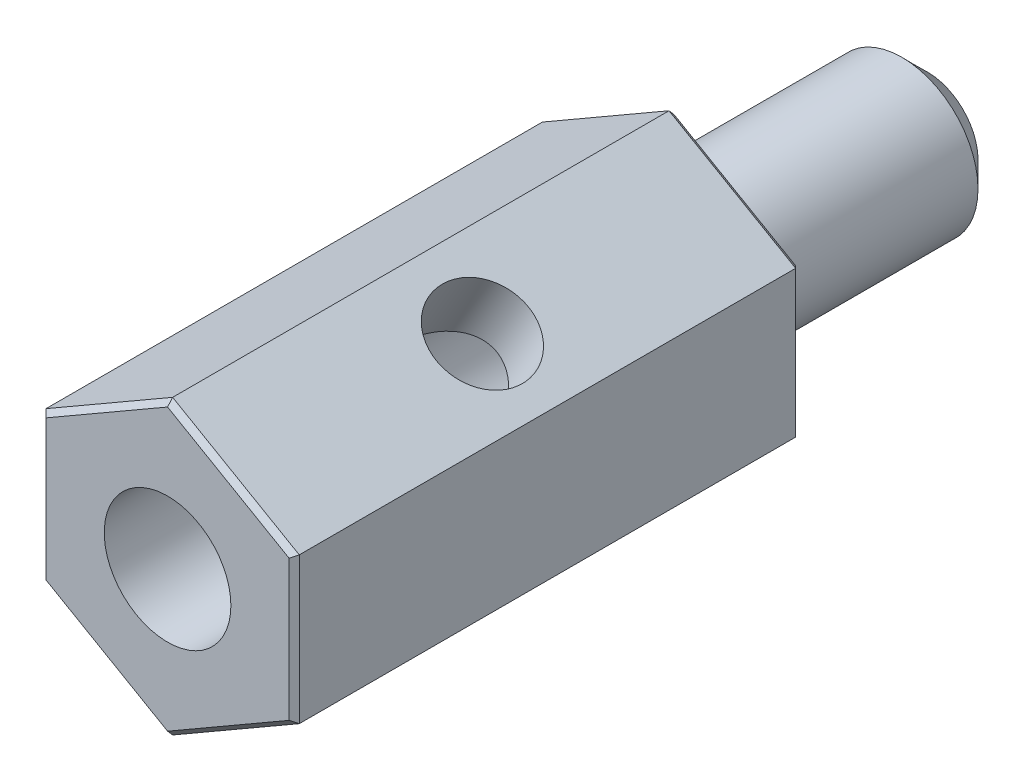
ISO-10303-21;
HEADER;
FILE_DESCRIPTION(('STEP AP214'),'2;1');
FILE_NAME('part.step','',(''),(''),'','','');
FILE_SCHEMA(('AUTOMOTIVE_DESIGN { 1 0 10303 214 1 1 1 1 }'));
ENDSEC;
DATA;
#1=APPLICATION_CONTEXT('core data for automotive mechanical design processes');
#2=APPLICATION_PROTOCOL_DEFINITION('international standard','automotive_design',2000,#1);
#3=PRODUCT_CONTEXT('',#1,'mechanical');
#4=PRODUCT('Part','Part','',(#3));
#5=PRODUCT_RELATED_PRODUCT_CATEGORY('part','',(#4));
#6=PRODUCT_DEFINITION_FORMATION('','',#4);
#7=PRODUCT_DEFINITION_CONTEXT('part definition',#1,'design');
#8=PRODUCT_DEFINITION('design','',#6,#7);
#9=PRODUCT_DEFINITION_SHAPE('','',#8);
#10=(LENGTH_UNIT() NAMED_UNIT(*) SI_UNIT(.MILLI.,.METRE.));
#11=(NAMED_UNIT(*) PLANE_ANGLE_UNIT() SI_UNIT($,.RADIAN.));
#12=(NAMED_UNIT(*) SI_UNIT($,.STERADIAN.) SOLID_ANGLE_UNIT());
#13=UNCERTAINTY_MEASURE_WITH_UNIT(LENGTH_MEASURE(1.E-05),#10,'distance_accuracy_value','');
#14=(GEOMETRIC_REPRESENTATION_CONTEXT(3) GLOBAL_UNCERTAINTY_ASSIGNED_CONTEXT((#13)) GLOBAL_UNIT_ASSIGNED_CONTEXT((#10,
#11,#12)) REPRESENTATION_CONTEXT('',''));
#15=CARTESIAN_POINT('',(0.,0.,0.));
#16=DIRECTION('',(0.,0.,1.));
#17=DIRECTION('',(1.,0.,0.));
#18=AXIS2_PLACEMENT_3D('',#15,#16,#17);
#19=CARTESIAN_POINT('',(0.,0.,0.));
#20=DIRECTION('',(0.,0.,1.));
#21=DIRECTION('',(1.,0.,0.));
#22=AXIS2_PLACEMENT_3D('',#19,#20,#21);
#23=PLANE('',#22);
#24=DIRECTION('',(0.,-1.,0.));
#25=VECTOR('',#24,1.);
#26=CARTESIAN_POINT('',(2.4,0.,0.));
#27=LINE('',#26,#25);
#28=CARTESIAN_POINT('',(2.39999999999999,1.38564064605513,0.));
#29=VERTEX_POINT('',#28);
#30=CARTESIAN_POINT('',(2.40000000000002,-1.38564064605508,0.));
#31=VERTEX_POINT('',#30);
#32=EDGE_CURVE('E50',#29,#31,#27,.T.);
#33=ORIENTED_EDGE('',*,*,#32,.T.);
#34=DIRECTION('',(-0.866025403784435,-0.500000000000007,0.));
#35=VECTOR('',#34,1.);
#36=CARTESIAN_POINT('',(1.20000000000002,-2.07846096908264,0.));
#37=LINE('',#36,#35);
#38=CARTESIAN_POINT('',(0.,-2.77128129211021,0.));
#39=VERTEX_POINT('',#38);
#40=EDGE_CURVE('E11',#31,#39,#37,.T.);
#41=ORIENTED_EDGE('',*,*,#40,.T.);
#42=DIRECTION('',(-0.866025403784441,0.499999999999995,0.));
#43=VECTOR('',#42,1.);
#44=CARTESIAN_POINT('',(-1.19999999999999,-2.07846096908266,0.));
#45=LINE('',#44,#43);
#46=CARTESIAN_POINT('',(-2.4,-1.38564064605511,0.));
#47=VERTEX_POINT('',#46);
#48=EDGE_CURVE('E216',#39,#47,#45,.T.);
#49=ORIENTED_EDGE('',*,*,#48,.T.);
#50=DIRECTION('',(0.,1.,0.));
#51=VECTOR('',#50,1.);
#52=CARTESIAN_POINT('',(-2.4,0.,0.));
#53=LINE('',#52,#51);
#54=CARTESIAN_POINT('',(-2.40000000000001,1.3856406460551,0.));
#55=VERTEX_POINT('',#54);
#56=EDGE_CURVE('E214',#47,#55,#53,.T.);
#57=ORIENTED_EDGE('',*,*,#56,.T.);
#58=DIRECTION('',(0.866025403784438,0.500000000000001,0.));
#59=VECTOR('',#58,1.);
#60=CARTESIAN_POINT('',(-1.2,2.07846096908265,0.));
#61=LINE('',#60,#59);
#62=CARTESIAN_POINT('',(0.,2.77128129211021,0.));
#63=VERTEX_POINT('',#62);
#64=EDGE_CURVE('E218',#55,#63,#61,.T.);
#65=ORIENTED_EDGE('',*,*,#64,.T.);
#66=DIRECTION('',(0.866025403784441,-0.499999999999995,0.));
#67=VECTOR('',#66,1.);
#68=CARTESIAN_POINT('',(1.19999999999999,2.07846096908267,0.));
#69=LINE('',#68,#67);
#70=EDGE_CURVE('E61',#63,#29,#69,.T.);
#71=ORIENTED_EDGE('',*,*,#70,.T.);
#72=EDGE_LOOP('',(#33,#41,#49,#57,#65,#71));
#73=FACE_BOUND('',#72,.T.);
#74=CARTESIAN_POINT('',(0.,0.,0.));
#75=DIRECTION('',(0.,0.,1.));
#76=DIRECTION('',(1.,0.,0.));
#77=AXIS2_PLACEMENT_3D('',#74,#75,#76);
#78=CIRCLE('',#77,1.5);
#79=CARTESIAN_POINT('',(1.5,0.,0.));
#80=VERTEX_POINT('',#79);
#81=EDGE_CURVE('E166',#80,#80,#78,.F.);
#82=ORIENTED_EDGE('',*,*,#81,.F.);
#83=EDGE_LOOP('',(#82));
#84=FACE_BOUND('',#83,.T.);
#85=ADVANCED_FACE('F37',(#73,#84),#23,.F.);
#86=CARTESIAN_POINT('',(2.49999999999999,1.44337567297409,10.));
#87=DIRECTION('',(-0.499999999999995,-0.866025403784442,0.));
#88=DIRECTION('',(0.866025403784442,-0.499999999999995,0.));
#89=AXIS2_PLACEMENT_3D('',#86,#87,#88);
#90=PLANE('',#89);
#91=CARTESIAN_POINT('',(1.24999999999999,2.16506350946111,5.03418419542379));
#92=DIRECTION('',(0.499999999999995,0.866025403784441,0.));
#93=DIRECTION('',(-0.866025403784442,0.499999999999995,0.));
#94=AXIS2_PLACEMENT_3D('',#91,#92,#93);
#95=CIRCLE('',#94,0.912306310352572);
#96=CARTESIAN_POINT('',(0.459919559201814,2.6212166646374,5.03418419542379));
#97=VERTEX_POINT('',#96);
#98=EDGE_CURVE('E257',#97,#97,#95,.T.);
#99=ORIENTED_EDGE('',*,*,#98,.F.);
#100=EDGE_LOOP('',(#99));
#101=FACE_BOUND('',#100,.T.);
#102=DIRECTION('',(0.,0.,-1.));
#103=VECTOR('',#102,1.);
#104=CARTESIAN_POINT('',(0.,2.88675134594813,10.));
#105=LINE('',#104,#103);
#106=CARTESIAN_POINT('',(0.,2.88675134594813,9.9));
#107=VERTEX_POINT('',#106);
#108=CARTESIAN_POINT('',(0.,2.88675134594813,0.100000000000001));
#109=VERTEX_POINT('',#108);
#110=EDGE_CURVE('E163',#107,#109,#105,.T.);
#111=ORIENTED_EDGE('',*,*,#110,.F.);
#112=DIRECTION('',(0.866025403784442,-0.499999999999995,0.));
#113=VECTOR('',#112,1.);
#114=CARTESIAN_POINT('',(2.49999999999999,1.44337567297409,9.9));
#115=LINE('',#114,#113);
#116=CARTESIAN_POINT('',(2.49999999999999,1.44337567297409,9.9));
#117=VERTEX_POINT('',#116);
#118=EDGE_CURVE('E212',#107,#117,#115,.T.);
#119=ORIENTED_EDGE('',*,*,#118,.T.);
#120=DIRECTION('',(0.,0.,-1.));
#121=VECTOR('',#120,1.);
#122=CARTESIAN_POINT('',(2.49999999999999,1.44337567297409,10.));
#123=LINE('',#122,#121);
#124=CARTESIAN_POINT('',(2.49999999999999,1.44337567297409,0.100000000000001));
#125=VERTEX_POINT('',#124);
#126=EDGE_CURVE('E141',#117,#125,#123,.T.);
#127=ORIENTED_EDGE('',*,*,#126,.T.);
#128=DIRECTION('',(-0.866025403784442,0.499999999999995,0.));
#129=VECTOR('',#128,1.);
#130=CARTESIAN_POINT('',(2.49999999999999,1.44337567297409,0.100000000000001));
#131=LINE('',#130,#129);
#132=EDGE_CURVE('E210',#125,#109,#131,.T.);
#133=ORIENTED_EDGE('',*,*,#132,.T.);
#134=EDGE_LOOP('',(#111,#119,#127,#133));
#135=FACE_BOUND('',#134,.T.);
#136=ADVANCED_FACE('F273',(#101,#135),#90,.F.);
#137=CARTESIAN_POINT('',(0.,2.88675134594813,10.));
#138=DIRECTION('',(0.500000000000001,-0.866025403784438,0.));
#139=DIRECTION('',(0.866025403784438,0.500000000000001,0.));
#140=AXIS2_PLACEMENT_3D('',#137,#138,#139);
#141=PLANE('',#140);
#142=DIRECTION('',(0.,0.,-1.));
#143=VECTOR('',#142,1.);
#144=CARTESIAN_POINT('',(-2.50000000000001,1.44337567297406,10.));
#145=LINE('',#144,#143);
#146=CARTESIAN_POINT('',(-2.50000000000001,1.44337567297406,9.9));
#147=VERTEX_POINT('',#146);
#148=CARTESIAN_POINT('',(-2.50000000000001,1.44337567297406,0.100000000000001));
#149=VERTEX_POINT('',#148);
#150=EDGE_CURVE('E160',#147,#149,#145,.T.);
#151=ORIENTED_EDGE('',*,*,#150,.F.);
#152=DIRECTION('',(0.866025403784438,0.500000000000001,0.));
#153=VECTOR('',#152,1.);
#154=CARTESIAN_POINT('',(0.,2.88675134594813,9.9));
#155=LINE('',#154,#153);
#156=EDGE_CURVE('E208',#147,#107,#155,.T.);
#157=ORIENTED_EDGE('',*,*,#156,.T.);
#158=ORIENTED_EDGE('',*,*,#110,.T.);
#159=DIRECTION('',(-0.866025403784438,-0.500000000000001,0.));
#160=VECTOR('',#159,1.);
#161=CARTESIAN_POINT('',(0.,2.88675134594813,0.100000000000001));
#162=LINE('',#161,#160);
#163=EDGE_CURVE('E206',#109,#149,#162,.T.);
#164=ORIENTED_EDGE('',*,*,#163,.T.);
#165=EDGE_LOOP('',(#151,#157,#158,#164));
#166=FACE_BOUND('',#165,.T.);
#167=ADVANCED_FACE('F279',(#166),#141,.F.);
#168=CARTESIAN_POINT('',(-2.50000000000001,1.44337567297406,10.));
#169=DIRECTION('',(1.,0.,0.));
#170=DIRECTION('',(0.,1.,0.));
#171=AXIS2_PLACEMENT_3D('',#168,#169,#170);
#172=PLANE('',#171);
#173=DIRECTION('',(0.,0.,-1.));
#174=VECTOR('',#173,1.);
#175=CARTESIAN_POINT('',(-2.5,-1.44337567297408,10.));
#176=LINE('',#175,#174);
#177=CARTESIAN_POINT('',(-2.5,-1.44337567297408,9.9));
#178=VERTEX_POINT('',#177);
#179=CARTESIAN_POINT('',(-2.5,-1.44337567297408,0.100000000000001));
#180=VERTEX_POINT('',#179);
#181=EDGE_CURVE('E157',#178,#180,#176,.T.);
#182=ORIENTED_EDGE('',*,*,#181,.F.);
#183=DIRECTION('',(0.,1.,0.));
#184=VECTOR('',#183,1.);
#185=CARTESIAN_POINT('',(-2.50000000000001,1.44337567297406,9.9));
#186=LINE('',#185,#184);
#187=EDGE_CURVE('E204',#178,#147,#186,.T.);
#188=ORIENTED_EDGE('',*,*,#187,.T.);
#189=ORIENTED_EDGE('',*,*,#150,.T.);
#190=DIRECTION('',(0.,-1.,0.));
#191=VECTOR('',#190,1.);
#192=CARTESIAN_POINT('',(-2.50000000000001,1.44337567297406,0.100000000000001));
#193=LINE('',#192,#191);
#194=EDGE_CURVE('E202',#149,#180,#193,.T.);
#195=ORIENTED_EDGE('',*,*,#194,.T.);
#196=EDGE_LOOP('',(#182,#188,#189,#195));
#197=FACE_BOUND('',#196,.T.);
#198=ADVANCED_FACE('F298',(#197),#172,.F.);
#199=CARTESIAN_POINT('',(-2.5,-1.44337567297408,10.));
#200=DIRECTION('',(0.499999999999995,0.866025403784442,0.));
#201=DIRECTION('',(-0.866025403784442,0.499999999999995,0.));
#202=AXIS2_PLACEMENT_3D('',#199,#200,#201);
#203=PLANE('',#202);
#204=CARTESIAN_POINT('',(-1.24999999999999,-2.1650635094611,5.03418419542379));
#205=DIRECTION('',(0.499999999999995,0.866025403784442,0.));
#206=DIRECTION('',(-0.866025403784442,0.499999999999995,0.));
#207=AXIS2_PLACEMENT_3D('',#204,#205,#206);
#208=CIRCLE('',#207,0.912306310352572);
#209=CARTESIAN_POINT('',(-2.04008044079817,-1.70891035428482,5.03418419542379));
#210=VERTEX_POINT('',#209);
#211=EDGE_CURVE('E241',#210,#210,#208,.T.);
#212=ORIENTED_EDGE('',*,*,#211,.T.);
#213=EDGE_LOOP('',(#212));
#214=FACE_BOUND('',#213,.T.);
#215=DIRECTION('',(0.,0.,-1.));
#216=VECTOR('',#215,1.);
#217=CARTESIAN_POINT('',(0.,-2.88675134594813,10.));
#218=LINE('',#217,#216);
#219=CARTESIAN_POINT('',(0.,-2.88675134594813,9.9));
#220=VERTEX_POINT('',#219);
#221=CARTESIAN_POINT('',(0.,-2.88675134594813,0.100000000000001));
#222=VERTEX_POINT('',#221);
#223=EDGE_CURVE('E154',#220,#222,#218,.T.);
#224=ORIENTED_EDGE('',*,*,#223,.F.);
#225=DIRECTION('',(-0.866025403784442,0.499999999999995,0.));
#226=VECTOR('',#225,1.);
#227=CARTESIAN_POINT('',(-2.5,-1.44337567297408,9.9));
#228=LINE('',#227,#226);
#229=EDGE_CURVE('E200',#220,#178,#228,.T.);
#230=ORIENTED_EDGE('',*,*,#229,.T.);
#231=ORIENTED_EDGE('',*,*,#181,.T.);
#232=DIRECTION('',(0.866025403784442,-0.499999999999995,0.));
#233=VECTOR('',#232,1.);
#234=CARTESIAN_POINT('',(-2.5,-1.44337567297408,0.100000000000001));
#235=LINE('',#234,#233);
#236=EDGE_CURVE('E198',#180,#222,#235,.T.);
#237=ORIENTED_EDGE('',*,*,#236,.T.);
#238=EDGE_LOOP('',(#224,#230,#231,#237));
#239=FACE_BOUND('',#238,.T.);
#240=ADVANCED_FACE('F294',(#214,#239),#203,.F.);
#241=CARTESIAN_POINT('',(0.,-2.88675134594813,10.));
#242=DIRECTION('',(-0.500000000000007,0.866025403784434,0.));
#243=DIRECTION('',(-0.866025403784435,-0.500000000000007,0.));
#244=AXIS2_PLACEMENT_3D('',#241,#242,#243);
#245=PLANE('',#244);
#246=DIRECTION('',(0.,0.,-1.));
#247=VECTOR('',#246,1.);
#248=CARTESIAN_POINT('',(2.50000000000002,-1.44337567297404,10.));
#249=LINE('',#248,#247);
#250=CARTESIAN_POINT('',(2.50000000000002,-1.44337567297404,9.9));
#251=VERTEX_POINT('',#250);
#252=CARTESIAN_POINT('',(2.50000000000002,-1.44337567297404,0.100000000000001));
#253=VERTEX_POINT('',#252);
#254=EDGE_CURVE('E145',#251,#253,#249,.T.);
#255=ORIENTED_EDGE('',*,*,#254,.F.);
#256=DIRECTION('',(-0.866025403784435,-0.500000000000007,0.));
#257=VECTOR('',#256,1.);
#258=CARTESIAN_POINT('',(0.,-2.88675134594813,9.9));
#259=LINE('',#258,#257);
#260=EDGE_CURVE('E196',#251,#220,#259,.T.);
#261=ORIENTED_EDGE('',*,*,#260,.T.);
#262=ORIENTED_EDGE('',*,*,#223,.T.);
#263=DIRECTION('',(0.866025403784435,0.500000000000007,0.));
#264=VECTOR('',#263,1.);
#265=CARTESIAN_POINT('',(0.,-2.88675134594813,0.100000000000001));
#266=LINE('',#265,#264);
#267=EDGE_CURVE('E193',#222,#253,#266,.T.);
#268=ORIENTED_EDGE('',*,*,#267,.T.);
#269=EDGE_LOOP('',(#255,#261,#262,#268));
#270=FACE_BOUND('',#269,.T.);
#271=ADVANCED_FACE('F290',(#270),#245,.F.);
#272=CARTESIAN_POINT('',(2.50000000000002,-1.44337567297404,10.));
#273=DIRECTION('',(-1.,0.,0.));
#274=DIRECTION('',(0.,-1.,0.));
#275=AXIS2_PLACEMENT_3D('',#272,#273,#274);
#276=PLANE('',#275);
#277=ORIENTED_EDGE('',*,*,#126,.F.);
#278=DIRECTION('',(0.,-1.,0.));
#279=VECTOR('',#278,1.);
#280=CARTESIAN_POINT('',(2.50000000000002,-1.44337567297404,9.9));
#281=LINE('',#280,#279);
#282=EDGE_CURVE('E190',#117,#251,#281,.T.);
#283=ORIENTED_EDGE('',*,*,#282,.T.);
#284=ORIENTED_EDGE('',*,*,#254,.T.);
#285=DIRECTION('',(0.,1.,0.));
#286=VECTOR('',#285,1.);
#287=CARTESIAN_POINT('',(2.50000000000002,-1.44337567297404,0.100000000000001));
#288=LINE('',#287,#286);
#289=EDGE_CURVE('E188',#253,#125,#288,.T.);
#290=ORIENTED_EDGE('',*,*,#289,.T.);
#291=EDGE_LOOP('',(#277,#283,#284,#290));
#292=FACE_BOUND('',#291,.T.);
#293=ADVANCED_FACE('F287',(#292),#276,.F.);
#294=CARTESIAN_POINT('',(0.,0.,10.));
#295=DIRECTION('',(0.,0.,1.));
#296=DIRECTION('',(1.,0.,0.));
#297=AXIS2_PLACEMENT_3D('',#294,#295,#296);
#298=PLANE('',#297);
#299=DIRECTION('',(0.866025403784435,0.500000000000007,0.));
#300=VECTOR('',#299,1.);
#301=CARTESIAN_POINT('',(2.45000000000001,-1.3567731325956,10.));
#302=LINE('',#301,#300);
#303=CARTESIAN_POINT('',(0.,-2.7712812921102,10.));
#304=VERTEX_POINT('',#303);
#305=CARTESIAN_POINT('',(2.40000000000001,-1.38564064605508,10.));
#306=VERTEX_POINT('',#305);
#307=EDGE_CURVE('E183',#304,#306,#302,.T.);
#308=ORIENTED_EDGE('',*,*,#307,.T.);
#309=DIRECTION('',(0.,1.,0.));
#310=VECTOR('',#309,1.);
#311=CARTESIAN_POINT('',(2.39999999999998,1.44337567297409,10.));
#312=LINE('',#311,#310);
#313=CARTESIAN_POINT('',(2.39999999999998,1.38564064605513,10.));
#314=VERTEX_POINT('',#313);
#315=EDGE_CURVE('E185',#306,#314,#312,.T.);
#316=ORIENTED_EDGE('',*,*,#315,.T.);
#317=DIRECTION('',(-0.866025403784441,0.499999999999995,0.));
#318=VECTOR('',#317,1.);
#319=CARTESIAN_POINT('',(-0.0500000000000009,2.80014880556968,10.));
#320=LINE('',#319,#318);
#321=CARTESIAN_POINT('',(0.,2.7712812921102,10.));
#322=VERTEX_POINT('',#321);
#323=EDGE_CURVE('E175',#314,#322,#320,.T.);
#324=ORIENTED_EDGE('',*,*,#323,.T.);
#325=DIRECTION('',(-0.866025403784438,-0.500000000000001,0.));
#326=VECTOR('',#325,1.);
#327=CARTESIAN_POINT('',(-2.45,1.35677313259561,10.));
#328=LINE('',#327,#326);
#329=CARTESIAN_POINT('',(-2.4,1.3856406460551,10.));
#330=VERTEX_POINT('',#329);
#331=EDGE_CURVE('E177',#322,#330,#328,.T.);
#332=ORIENTED_EDGE('',*,*,#331,.T.);
#333=DIRECTION('',(0.,-1.,0.));
#334=VECTOR('',#333,1.);
#335=CARTESIAN_POINT('',(-2.39999999999999,-1.44337567297408,10.));
#336=LINE('',#335,#334);
#337=CARTESIAN_POINT('',(-2.39999999999999,-1.38564064605511,10.));
#338=VERTEX_POINT('',#337);
#339=EDGE_CURVE('E179',#330,#338,#336,.T.);
#340=ORIENTED_EDGE('',*,*,#339,.T.);
#341=DIRECTION('',(0.866025403784441,-0.499999999999995,0.));
#342=VECTOR('',#341,1.);
#343=CARTESIAN_POINT('',(0.0500000000000213,-2.80014880556968,10.));
#344=LINE('',#343,#342);
#345=EDGE_CURVE('E181',#338,#304,#344,.T.);
#346=ORIENTED_EDGE('',*,*,#345,.T.);
#347=EDGE_LOOP('',(#308,#316,#324,#332,#340,#346));
#348=FACE_BOUND('',#347,.T.);
#349=CARTESIAN_POINT('',(0.,0.,10.));
#350=DIRECTION('',(0.,0.,1.));
#351=DIRECTION('',(1.,0.,0.));
#352=AXIS2_PLACEMENT_3D('',#349,#350,#351);
#353=CIRCLE('',#352,1.24999999999999);
#354=CARTESIAN_POINT('',(1.24999999999999,0.,10.));
#355=VERTEX_POINT('',#354);
#356=EDGE_CURVE('E142',#355,#355,#353,.T.);
#357=ORIENTED_EDGE('',*,*,#356,.F.);
#358=EDGE_LOOP('',(#357));
#359=FACE_BOUND('',#358,.T.);
#360=ADVANCED_FACE('F285',(#348,#359),#298,.T.);
#361=CARTESIAN_POINT('',(0.,0.,-5.));
#362=DIRECTION('',(0.,0.,1.));
#363=DIRECTION('',(1.,0.,0.));
#364=AXIS2_PLACEMENT_3D('',#361,#362,#363);
#365=CYLINDRICAL_SURFACE('',#364,1.5);
#366=CARTESIAN_POINT('',(0.,0.,-4.5));
#367=DIRECTION('',(0.,0.,-1.));
#368=DIRECTION('',(-1.,0.,0.));
#369=AXIS2_PLACEMENT_3D('',#366,#367,#368);
#370=CIRCLE('',#369,1.5);
#371=CARTESIAN_POINT('',(-1.5,0.,-4.5));
#372=VERTEX_POINT('',#371);
#373=EDGE_CURVE('E172',#372,#372,#370,.F.);
#374=ORIENTED_EDGE('',*,*,#373,.T.);
#375=EDGE_LOOP('',(#374));
#376=FACE_BOUND('',#375,.T.);
#377=ORIENTED_EDGE('',*,*,#81,.T.);
#378=EDGE_LOOP('',(#377));
#379=FACE_BOUND('',#378,.T.);
#380=ADVANCED_FACE('F398',(#376,#379),#365,.T.);
#381=CARTESIAN_POINT('',(0.,0.,-5.));
#382=DIRECTION('',(0.,0.,-1.));
#383=DIRECTION('',(-1.,0.,0.));
#384=AXIS2_PLACEMENT_3D('',#381,#382,#383);
#385=PLANE('',#384);
#386=CARTESIAN_POINT('',(0.,0.,-5.));
#387=DIRECTION('',(0.,0.,-1.));
#388=DIRECTION('',(-1.,0.,0.));
#389=AXIS2_PLACEMENT_3D('',#386,#387,#388);
#390=CIRCLE('',#389,1.);
#391=CARTESIAN_POINT('',(-1.,0.,-5.));
#392=VERTEX_POINT('',#391);
#393=EDGE_CURVE('E169',#392,#392,#390,.T.);
#394=ORIENTED_EDGE('',*,*,#393,.T.);
#395=EDGE_LOOP('',(#394));
#396=FACE_BOUND('',#395,.T.);
#397=ADVANCED_FACE('F308',(#396),#385,.T.);
#398=CARTESIAN_POINT('',(0.,0.,-5.));
#399=DIRECTION('',(0.,0.,1.));
#400=DIRECTION('',(1.,0.,0.));
#401=AXIS2_PLACEMENT_3D('',#398,#399,#400);
#402=CONICAL_SURFACE('',#401,1.,0.785398163397445);
#403=ORIENTED_EDGE('',*,*,#373,.F.);
#404=EDGE_LOOP('',(#403));
#405=FACE_BOUND('',#404,.T.);
#406=ORIENTED_EDGE('',*,*,#393,.F.);
#407=EDGE_LOOP('',(#406));
#408=FACE_BOUND('',#407,.T.);
#409=ADVANCED_FACE('F135',(#405,#408),#402,.T.);
#410=CARTESIAN_POINT('',(0.,0.,2.));
#411=DIRECTION('',(0.,0.,1.));
#412=DIRECTION('',(1.,0.,0.));
#413=AXIS2_PLACEMENT_3D('',#410,#411,#412);
#414=CONICAL_SURFACE('',#413,1.25,1.02974425867665);
#415=CARTESIAN_POINT('',(0.,0.,1.24892422621555));
#416=VERTEX_POINT('',#415);
#417=VERTEX_LOOP('',#416);
#418=FACE_BOUND('',#417,.T.);
#419=CARTESIAN_POINT('',(0.,0.,2.));
#420=DIRECTION('',(0.,0.,1.));
#421=DIRECTION('',(1.,0.,0.));
#422=AXIS2_PLACEMENT_3D('',#419,#420,#421);
#423=CIRCLE('',#422,1.25);
#424=CARTESIAN_POINT('',(1.25,0.,2.));
#425=VERTEX_POINT('',#424);
#426=EDGE_CURVE('E139',#425,#425,#423,.T.);
#427=ORIENTED_EDGE('',*,*,#426,.T.);
#428=EDGE_LOOP('',(#427));
#429=FACE_BOUND('',#428,.T.);
#430=ADVANCED_FACE('F131',(#418,#429),#414,.F.);
#431=CARTESIAN_POINT('',(0.,0.,10.));
#432=DIRECTION('',(0.,0.,1.));
#433=DIRECTION('',(1.,0.,0.));
#434=AXIS2_PLACEMENT_3D('',#431,#432,#433);
#435=CYLINDRICAL_SURFACE('',#434,1.24999999999999);
#436=CARTESIAN_POINT('',(-1.21733832430966,-0.283879206999961,5.03418419542379));
#437=CARTESIAN_POINT('',(-1.21733899773192,-0.283891360588658,4.99113597329391));
#438=CARTESIAN_POINT('',(-1.21633235710164,-0.288303786191605,4.94803144928707));
#439=CARTESIAN_POINT('',(-1.21220655605001,-0.305159520375222,4.86349320300688));
#440=CARTESIAN_POINT('',(-1.20908091189832,-0.317627471750742,4.82206502350204));
#441=CARTESIAN_POINT('',(-1.2005180098721,-0.348580564292917,4.74246464285655));
#442=CARTESIAN_POINT('',(-1.19511076328627,-0.366986879723065,4.70425763497978));
#443=CARTESIAN_POINT('',(-1.18167938674577,-0.408170254480402,4.63083151240586));
#444=CARTESIAN_POINT('',(-1.17365544485873,-0.430946999646793,4.59561218320684));
#445=CARTESIAN_POINT('',(-1.15279059734666,-0.484298438319563,4.52165713082937));
#446=CARTESIAN_POINT('',(-1.13931589848254,-0.51552790434359,4.48357248244704));
#447=CARTESIAN_POINT('',(-1.10752698851714,-0.58069153480326,4.41193242427019));
#448=CARTESIAN_POINT('',(-1.08920614414229,-0.614629361566165,4.37838331844734));
#449=CARTESIAN_POINT('',(-1.04319873538033,-0.69032552882698,4.31046257003285));
#450=CARTESIAN_POINT('',(-1.01439830734873,-0.732353345853552,4.27712510586413));
#451=CARTESIAN_POINT('',(-0.948541105490159,-0.815829115329295,4.21898794888725));
#452=CARTESIAN_POINT('',(-0.911502775906145,-0.857278146691154,4.19416949333009));
#453=CARTESIAN_POINT('',(-0.841244515332798,-0.925456868934762,4.16045337934492));
#454=CARTESIAN_POINT('',(-0.810002332980704,-0.952984988075935,4.14902858039868));
#455=CARTESIAN_POINT('',(-0.743937548228892,-1.00539976854893,4.13192668041549));
#456=CARTESIAN_POINT('',(-0.709117992561951,-1.03028864152128,4.12624473235516));
#457=CARTESIAN_POINT('',(-0.63667460423285,-1.07656738038242,4.12095556974974));
#458=CARTESIAN_POINT('',(-0.599044455300013,-1.09794899767541,4.12136247399952));
#459=CARTESIAN_POINT('',(-0.522215868589395,-1.13650290080385,4.12825885848648));
#460=CARTESIAN_POINT('',(-0.48301703393617,-1.15367411348035,4.13474988743236));
#461=CARTESIAN_POINT('',(-0.405471458340201,-1.18311633343876,4.15315276202783));
#462=CARTESIAN_POINT('',(-0.367133731702987,-1.19551705533181,4.16489889274858));
#463=CARTESIAN_POINT('',(-0.291165216619854,-1.21625459543601,4.19320864249756));
#464=CARTESIAN_POINT('',(-0.253534574928121,-1.22459057878304,4.20977325008712));
#465=CARTESIAN_POINT('',(-0.175715916942084,-1.23828600873145,4.24920000404646));
#466=CARTESIAN_POINT('',(-0.13570387288318,-1.24321553180818,4.27255534955382));
#467=CARTESIAN_POINT('',(-0.058378333770171,-1.2492395033679,4.32380440915834));
#468=CARTESIAN_POINT('',(-0.0210674642811273,-1.25033026829186,4.35170245546113));
#469=CARTESIAN_POINT('',(0.0569037241374506,-1.24942188426081,4.4172257217767));
#470=CARTESIAN_POINT('',(0.096851220867586,-1.246795532768,4.45569179893909));
#471=CARTESIAN_POINT('',(0.170632249071385,-1.23885379735293,4.5379007505362));
#472=CARTESIAN_POINT('',(0.204464673647443,-1.23353792725748,4.58164457791893));
#473=CARTESIAN_POINT('',(0.257759579588436,-1.22336875901556,4.66422462175497));
#474=CARTESIAN_POINT('',(0.278747649223608,-1.21866218151301,4.70209050363644));
#475=CARTESIAN_POINT('',(0.314539698629268,-1.20991973375447,4.78069589242066));
#476=CARTESIAN_POINT('',(0.329357571939122,-1.20588236910567,4.82142869917813));
#477=CARTESIAN_POINT('',(0.349532399252601,-1.20017484967551,4.89807259134956));
#478=CARTESIAN_POINT('',(0.356057539205465,-1.19822163749426,4.93365004165482));
#479=CARTESIAN_POINT('',(0.363174838209644,-1.19608510645998,5.00543815205792));
#480=CARTESIAN_POINT('',(0.363772310164229,-1.19590020269703,5.04164821597975));
#481=CARTESIAN_POINT('',(0.358978469006673,-1.19734682051289,5.11357874590301));
#482=CARTESIAN_POINT('',(0.353593740111891,-1.19897634507353,5.14929970646152));
#483=CARTESIAN_POINT('',(0.337401970497872,-1.20363159671711,5.21941088083046));
#484=CARTESIAN_POINT('',(0.32658644908339,-1.2066595069159,5.25379892240767));
#485=CARTESIAN_POINT('',(0.295105373651545,-1.21481253012663,5.33411476947649));
#486=CARTESIAN_POINT('',(0.272228589293161,-1.22029158457725,5.37913334427675));
#487=CARTESIAN_POINT('',(0.219576278379404,-1.23085671230332,5.46498833246351));
#488=CARTESIAN_POINT('',(0.189786928042674,-1.23594197051804,5.50581612594338));
#489=CARTESIAN_POINT('',(0.123802125314117,-1.24431265146819,5.58429878955093));
#490=CARTESIAN_POINT('',(0.0874384557452363,-1.24753819890181,5.62181823472015));
#491=CARTESIAN_POINT('',(0.0101223194436467,-1.25055745606983,5.69189660960777));
#492=CARTESIAN_POINT('',(-0.0308264234878824,-1.25035393095522,5.72445951482252));
#493=CARTESIAN_POINT('',(-0.114799864826307,-1.24540154915702,5.78295898610717));
#494=CARTESIAN_POINT('',(-0.157695313384704,-1.24081789740209,5.8090931255175));
#495=CARTESIAN_POINT('',(-0.245821591374649,-1.22640201771688,5.85535884799771));
#496=CARTESIAN_POINT('',(-0.291051824752226,-1.21657112344295,5.87549195428437));
#497=CARTESIAN_POINT('',(-0.382857384497231,-1.19088530992934,5.90888349523033));
#498=CARTESIAN_POINT('',(-0.429440865581431,-1.17498000526243,5.92208217425121));
#499=CARTESIAN_POINT('',(-0.521679305851184,-1.13702571332203,5.94038270513778));
#500=CARTESIAN_POINT('',(-0.567335279957909,-1.11498387802865,5.94549393666065));
#501=CARTESIAN_POINT('',(-0.649252344615926,-1.06904152169675,5.94709710253871));
#502=CARTESIAN_POINT('',(-0.685912286025267,-1.04588136766144,5.94473777711806));
#503=CARTESIAN_POINT('',(-0.756042077739697,-0.99636436017723,5.93398649096333));
#504=CARTESIAN_POINT('',(-0.789511823717303,-0.970007402248738,5.92559433301694));
#505=CARTESIAN_POINT('',(-0.851765338842816,-0.915784253566957,5.90352891856287));
#506=CARTESIAN_POINT('',(-0.880643859894585,-0.887970892603088,5.88999015306383));
#507=CARTESIAN_POINT('',(-0.934402525618939,-0.831216886265566,5.85821900818039));
#508=CARTESIAN_POINT('',(-0.959282026578222,-0.802276060336017,5.83998587438056));
#509=CARTESIAN_POINT('',(-1.00804740924192,-0.740331573634392,5.79674769619995));
#510=CARTESIAN_POINT('',(-1.0313761711138,-0.707292334353044,5.77116843071552));
#511=CARTESIAN_POINT('',(-1.07322958825063,-0.642016601876122,5.71541564529749));
#512=CARTESIAN_POINT('',(-1.0917478564317,-0.609781226790285,5.68523610085162));
#513=CARTESIAN_POINT('',(-1.12750831057694,-0.541281937821917,5.61459000414985));
#514=CARTESIAN_POINT('',(-1.14383024830029,-0.505425496151732,5.57325975521285));
#515=CARTESIAN_POINT('',(-1.17104371222631,-0.438692373083372,5.48510915280484));
#516=CARTESIAN_POINT('',(-1.18193823441287,-0.40781295070707,5.43829184591195));
#517=CARTESIAN_POINT('',(-1.19664357109616,-0.361869989437066,5.35367046958199));
#518=CARTESIAN_POINT('',(-1.2015906740354,-0.34481229306072,5.31714972850733));
#519=CARTESIAN_POINT('',(-1.20940696101468,-0.316315822064717,5.24181238724363));
#520=CARTESIAN_POINT('',(-1.21228279421721,-0.30485910564521,5.20300357020606));
#521=CARTESIAN_POINT('',(-1.21527250502875,-0.292628198831448,5.14221443211921));
#522=CARTESIAN_POINT('',(-1.21604862652197,-0.289364004972497,5.12075202791445));
#523=CARTESIAN_POINT('',(-1.21708141561944,-0.284986240208583,5.07759261724781));
#524=CARTESIAN_POINT('',(-1.21733798466914,-0.283873077337275,5.05589556706022));
#525=CARTESIAN_POINT('',(-1.21733832430966,-0.283879206999961,5.03418419542379));
#526=B_SPLINE_CURVE_WITH_KNOTS('',3,(#436,#437,#438,#439,#440,#441,#442,#443,#444,#445,#446,
#447,#448,#449,#450,#451,#452,#453,#454,#455,#456,#457,#458,#459,#460,#461,#462,#463,#464,#465,
#466,#467,#468,#469,#470,#471,#472,#473,#474,#475,#476,#477,#478,#479,#480,#481,#482,#483,#484,
#485,#486,#487,#488,#489,#490,#491,#492,#493,#494,#495,#496,#497,#498,#499,#500,#501,#502,#503,
#504,#505,#506,#507,#508,#509,#510,#511,#512,#513,#514,#515,#516,#517,#518,#519,#520,#521,#522,
#523,#524,#525),.UNSPECIFIED.,.T.,.F.,(4,2,2,2,2,2,2,2,2,2,2,2,2,2,2,2,2,2,2,2,2,2,2,2,2,2,2,2,
2,2,2,2,2,2,2,2,2,2,2,2,2,2,2,2,4),(0.,0.12903399974095,0.258464610590651,0.386243351944347,
0.514012911582424,0.666666960767485,0.819531049762562,1.00117317125746,1.18241262753394,
1.31139989924841,1.44027821328074,1.56945541580413,1.6986655092059,1.8240605205619,
1.94948127619262,2.08874102483449,2.22813436664072,2.3940419671078,2.55997956872764,
2.69019988567042,2.82012537657909,2.92831098832297,3.03639962573018,3.14436941479806,
3.25250833569376,3.40405841399852,3.55591421529559,3.71241958809259,3.86879876342487,
4.01950339078139,4.17016973278266,4.32211394758596,4.47388181107185,4.60350702898104,
4.73313648451026,4.8595884994405,4.98606084872806,5.12910105210384,5.27233021598037,
5.44293246882377,5.61344044299564,5.73488083460753,5.85592962090337,5.92099557979699,
5.98607387997993),.UNSPECIFIED.);
#527=CARTESIAN_POINT('',(-1.21733832430966,-0.283879206999961,5.03418419542379));
#528=VERTEX_POINT('',#527);
#529=EDGE_CURVE('E41',#528,#528,#526,.T.);
#530=ORIENTED_EDGE('',*,*,#529,.T.);
#531=EDGE_LOOP('',(#530));
#532=FACE_BOUND('',#531,.T.);
#533=CARTESIAN_POINT('',(-0.362822557286697,1.19618551735252,5.03418419542379));
#534=CARTESIAN_POINT('',(-0.362812368681266,1.19619217734765,5.07723241755368));
#535=CARTESIAN_POINT('',(-0.358487775701666,1.19752661379082,5.12033694156052));
#536=CARTESIAN_POINT('',(-0.341827381173403,1.20238143236097,5.20487518784071));
#537=CARTESIAN_POINT('',(-0.329466996473206,1.20590852081017,5.24630336734554));
#538=CARTESIAN_POINT('',(-0.298379380992882,1.21396937639643,5.32590374799104));
#539=CARTESIAN_POINT('',(-0.27973542094739,1.21848972120365,5.3641107558678));
#540=CARTESIAN_POINT('',(-0.237353883923709,1.22744949529045,5.43753687844172));
#541=CARTESIAN_POINT('',(-0.213616673050572,1.23188893036098,5.47275620764074));
#542=CARTESIAN_POINT('',(-0.156980548075469,1.24049516170582,5.54671126001822));
#543=CARTESIAN_POINT('',(-0.12319768771998,1.24444046319316,5.58479590840055));
#544=CARTESIAN_POINT('',(-0.0508698733563847,1.24949227483435,5.6564359665774));
#545=CARTESIAN_POINT('',(-0.0123184310430502,1.2505948715684,5.68998507240025));
#546=CARTESIAN_POINT('',(0.0762400771549107,1.24859937044866,5.75790582081473));
#547=CARTESIAN_POINT('',(0.127037448381327,1.24467137664671,5.79124328498346));
#548=CARTESIAN_POINT('',(0.232258186277061,1.2293752515529,5.84938044196033));
#549=CARTESIAN_POINT('',(0.286673265190696,1.21802363290034,5.8741988975175));
#550=CARTESIAN_POINT('',(0.380846900937897,1.19126755553992,5.90791501150267));
#551=CARTESIAN_POINT('',(0.420308042608604,1.17797509152392,5.9193398104489));
#552=CARTESIAN_POINT('',(0.498732966407911,1.1469686998698,5.93644171043209));
#553=CARTESIAN_POINT('',(0.537697140507002,1.12925851659992,5.94212365849243));
#554=CARTESIAN_POINT('',(0.613997398180401,1.08966007140127,5.94741282109785));
#555=CARTESIAN_POINT('',(0.651329496396545,1.06776221512373,5.94700591684806));
#556=CARTESIAN_POINT('',(0.723132449276133,1.02050365885971,5.94010953236111));
#557=CARTESIAN_POINT('',(0.757602572994378,0.995142078589518,5.93361850341522));
#558=CARTESIAN_POINT('',(0.821873071220153,0.942706750151527,5.91521562881975));
#559=CARTESIAN_POINT('',(0.85178127472341,0.915705665906882,5.903469498099));
#560=CARTESIAN_POINT('',(0.907724768807214,0.860283772009209,5.87515974835002));
#561=CARTESIAN_POINT('',(0.93375926299713,0.831862672016972,5.85859514076047));
#562=CARTESIAN_POINT('',(0.98452918224122,0.771317452286856,5.81916838680113));
#563=CARTESIAN_POINT('',(1.00880429648366,0.73913076721287,5.79581304129377));
#564=CARTESIAN_POINT('',(1.05268397844256,0.675176871759536,5.74456398168925));
#565=CARTESIAN_POINT('',(1.07228404332079,0.643410093406718,5.71666593538646));
#566=CARTESIAN_POINT('',(1.1104829538828,0.575430871457444,5.65114266907089));
#567=CARTESIAN_POINT('',(1.12818221513583,0.539522148725148,5.6126765919085));
#568=CARTESIAN_POINT('',(1.15819498461814,0.471655036275785,5.53046764031139));
#569=CARTESIAN_POINT('',(1.1705075183603,0.439697362073576,5.48672381292866));
#570=CARTESIAN_POINT('',(1.18834821329793,0.388458035515411,5.40414376909262));
#571=CARTESIAN_POINT('',(1.19476623243343,0.367928545283682,5.36627788721114));
#572=CARTESIAN_POINT('',(1.20509107528611,0.332560497365602,5.28767249842693));
#573=CARTESIAN_POINT('',(1.20900355159083,0.317709160324806,5.24693969166946));
#574=CARTESIAN_POINT('',(1.21414810842846,0.297383487639292,5.17029579949803));
#575=CARTESIAN_POINT('',(1.21571914703695,0.290755944586239,5.13471834919277));
#576=CARTESIAN_POINT('',(1.21742750638738,0.283523917325149,5.06293023878967));
#577=CARTESIAN_POINT('',(1.2175661110087,0.282914039552954,5.02672017486784));
#578=CARTESIAN_POINT('',(1.21642199820802,0.287788936685034,4.95478964494457));
#579=CARTESIAN_POINT('',(1.21514084342624,0.293267010980729,4.91906868438606));
#580=CARTESIAN_POINT('',(1.21107652480358,0.309617120620485,4.84895751001713));
#581=CARTESIAN_POINT('',(1.20829101124887,0.320497592019995,4.81456946843991));
#582=CARTESIAN_POINT('',(1.19961119875107,0.351837514687789,4.7342536213711));
#583=CARTESIAN_POINT('',(1.19291780691484,0.374388918324359,4.68923504657083));
#584=CARTESIAN_POINT('',(1.17574132046296,0.425269721006663,4.60338005838407));
#585=CARTESIAN_POINT('',(1.16525060809335,0.453610684267865,4.56255226490421));
#586=CARTESIAN_POINT('',(1.13950742907888,0.514940540169575,4.48406960129666));
#587=CARTESIAN_POINT('',(1.12411900031307,0.548045175507863,4.44655015612744));
#588=CARTESIAN_POINT('',(1.08807568557033,0.616512542251506,4.37647178123982));
#589=CARTESIAN_POINT('',(1.06742505618501,0.651873431325945,4.34390887602506));
#590=CARTESIAN_POINT('',(1.02114944706931,0.722120373869119,4.28540940474042));
#591=CARTESIAN_POINT('',(0.995732163928248,0.756977096149957,4.25927526533008));
#592=CARTESIAN_POINT('',(0.939184506907981,0.826088751787613,4.21300954284988));
#593=CARTESIAN_POINT('',(0.908055586036049,0.860343835774728,4.19287643656322));
#594=CARTESIAN_POINT('',(0.839908239143886,0.927006875965744,4.15948489561725));
#595=CARTESIAN_POINT('',(0.80284210070531,0.959396701647917,4.14628621659638));
#596=CARTESIAN_POINT('',(0.723853499567395,1.02030038815678,4.1279856857098));
#597=CARTESIAN_POINT('',(0.681936723203938,1.04881870392104,4.12287445418693));
#598=CARTESIAN_POINT('',(0.601190943181782,1.09678978475238,4.12127128830888));
#599=CARTESIAN_POINT('',(0.562803690726976,1.11695814829647,4.12363061372953));
#600=CARTESIAN_POINT('',(0.484855808469049,1.15293382574117,4.13438189988426));
#601=CARTESIAN_POINT('',(0.445295140347694,1.16874099705174,4.14277405783065));
#602=CARTESIAN_POINT('',(0.367209758553335,1.19554254828442,4.16483947228472));
#603=CARTESIAN_POINT('',(0.328683420868113,1.20664540065704,4.17837823778376));
#604=CARTESIAN_POINT('',(0.252653676751099,1.22482476767913,4.2101493826672));
#605=CARTESIAN_POINT('',(0.215150435809964,1.23190063457857,4.22838251646703));
#606=CARTESIAN_POINT('',(0.137122245370123,1.24316045143978,4.27162069464764));
#607=CARTESIAN_POINT('',(0.0968450438948181,1.246844132219,4.29719996013206));
#608=CARTESIAN_POINT('',(0.0193878927507523,1.25045238845622,4.3529527455501));
#609=CARTESIAN_POINT('',(-0.0177878950646343,1.2503719915922,4.38313228999597));
#610=CARTESIAN_POINT('',(-0.0949902465250358,1.24709180884866,4.45377838669773));
#611=CARTESIAN_POINT('',(-0.134203804762405,1.24329880072098,4.49510863563473));
#612=CARTESIAN_POINT('',(-0.205603116576485,1.2334997902717,4.58325923804274));
#613=CARTESIAN_POINT('',(-0.237792741901833,1.2274950120592,4.63007654493564));
#614=CARTESIAN_POINT('',(-0.284933181828388,1.21725872656314,4.7146979212656));
#615=CARTESIAN_POINT('',(-0.302179131689962,1.21301419519548,4.75121866234025));
#616=CARTESIAN_POINT('',(-0.330765942980352,1.20553506278481,4.82655600360396));
#617=CARTESIAN_POINT('',(-0.342125667044861,1.20229724918548,4.86536482064152));
#618=CARTESIAN_POINT('',(-0.35421279846267,1.19877096129137,4.92615395872838));
#619=CARTESIAN_POINT('',(-0.357427734014007,1.19781100529144,4.94761636293313));
#620=CARTESIAN_POINT('',(-0.361735384060087,1.19651654450465,4.99077577359977));
#621=CARTESIAN_POINT('',(-0.362827695910037,1.19618215838386,5.01247282378737));
#622=CARTESIAN_POINT('',(-0.362822557286697,1.19618551735252,5.03418419542379));
#623=B_SPLINE_CURVE_WITH_KNOTS('',3,(#533,#534,#535,#536,#537,#538,#539,#540,#541,#542,#543,
#544,#545,#546,#547,#548,#549,#550,#551,#552,#553,#554,#555,#556,#557,#558,#559,#560,#561,#562,
#563,#564,#565,#566,#567,#568,#569,#570,#571,#572,#573,#574,#575,#576,#577,#578,#579,#580,#581,
#582,#583,#584,#585,#586,#587,#588,#589,#590,#591,#592,#593,#594,#595,#596,#597,#598,#599,#600,
#601,#602,#603,#604,#605,#606,#607,#608,#609,#610,#611,#612,#613,#614,#615,#616,#617,#618,#619,
#620,#621,#622),.UNSPECIFIED.,.T.,.F.,(4,2,2,2,2,2,2,2,2,2,2,2,2,2,2,2,2,2,2,2,2,2,2,2,2,2,2,2,
2,2,2,2,2,2,2,2,2,2,2,2,2,2,2,2,4),(0.,0.12903399974095,0.258464610590651,0.386243351944347,
0.514012911582424,0.666666960767485,0.819531049762561,1.00117317125746,1.18241262753394,
1.31139989924841,1.44027821328074,1.56945541580413,1.6986655092059,1.8240605205619,
1.94948127619262,2.08874102483449,2.22813436664072,2.3940419671078,2.55997956872764,
2.69019988567041,2.82012537657909,2.92831098832297,3.03639962573017,3.14436941479806,
3.25250833569376,3.40405841399852,3.55591421529559,3.71241958809259,3.86879876342487,
4.01950339078138,4.17016973278266,4.32211394758595,4.47388181107185,4.60350702898104,
4.73313648451026,4.8595884994405,4.98606084872806,5.12910105210384,5.27233021598037,
5.44293246882377,5.61344044299564,5.73488083460753,5.85592962090337,5.92099557979699,
5.98607387997993),.UNSPECIFIED.);
#624=CARTESIAN_POINT('',(-0.362822557286697,1.19618551735252,5.03418419542379));
#625=VERTEX_POINT('',#624);
#626=EDGE_CURVE('E253',#625,#625,#623,.T.);
#627=ORIENTED_EDGE('',*,*,#626,.T.);
#628=EDGE_LOOP('',(#627));
#629=FACE_BOUND('',#628,.T.);
#630=ORIENTED_EDGE('',*,*,#426,.F.);
#631=EDGE_LOOP('',(#630));
#632=FACE_BOUND('',#631,.T.);
#633=ORIENTED_EDGE('',*,*,#356,.T.);
#634=EDGE_LOOP('',(#633));
#635=FACE_BOUND('',#634,.T.);
#636=ADVANCED_FACE('F134',(#532,#629,#632,#635),#435,.F.);
#637=CARTESIAN_POINT('',(-2.4,0.,10.));
#638=DIRECTION('',(-0.707106781186548,0.,0.707106781186547));
#639=DIRECTION('',(0.,1.,0.));
#640=AXIS2_PLACEMENT_3D('',#637,#638,#639);
#641=PLANE('',#640);
#642=DIRECTION('',(0.654653670707978,-0.377964473009225,0.654653670707978));
#643=VECTOR('',#642,1.);
#644=CARTESIAN_POINT('',(-2.05714285714286,1.18769198233294,10.3428571428571));
#645=LINE('',#644,#643);
#646=EDGE_CURVE('E233',#147,#330,#645,.T.);
#647=ORIENTED_EDGE('',*,*,#646,.F.);
#648=ORIENTED_EDGE('',*,*,#187,.F.);
#649=DIRECTION('',(0.654653670707974,0.377964473009236,0.654653670707976));
#650=VECTOR('',#649,1.);
#651=CARTESIAN_POINT('',(-2.05714285714285,-1.18769198233295,10.3428571428571));
#652=LINE('',#651,#650);
#653=EDGE_CURVE('E148',#338,#178,#652,.F.);
#654=ORIENTED_EDGE('',*,*,#653,.F.);
#655=ORIENTED_EDGE('',*,*,#339,.F.);
#656=EDGE_LOOP('',(#647,#648,#654,#655));
#657=FACE_BOUND('',#656,.T.);
#658=ADVANCED_FACE('F329',(#657),#641,.T.);
#659=CARTESIAN_POINT('',(-1.19999999999999,-2.07846096908266,10.));
#660=DIRECTION('',(-0.353553390593269,-0.612372435695795,0.70710678118655));
#661=DIRECTION('',(-0.866025403784442,0.499999999999995,0.));
#662=AXIS2_PLACEMENT_3D('',#659,#660,#661);
#663=PLANE('',#662);
#664=ORIENTED_EDGE('',*,*,#653,.T.);
#665=ORIENTED_EDGE('',*,*,#229,.F.);
#666=DIRECTION('',(0.,0.755928946018455,0.654653670707976));
#667=VECTOR('',#666,1.);
#668=CARTESIAN_POINT('',(0.,-2.37538396466589,10.3428571428571));
#669=LINE('',#668,#667);
#670=EDGE_CURVE('E230',#304,#220,#669,.F.);
#671=ORIENTED_EDGE('',*,*,#670,.F.);
#672=ORIENTED_EDGE('',*,*,#345,.F.);
#673=EDGE_LOOP('',(#664,#665,#671,#672));
#674=FACE_BOUND('',#673,.T.);
#675=ADVANCED_FACE('F325',(#674),#663,.T.);
#676=CARTESIAN_POINT('',(-1.2,2.07846096908265,10.));
#677=DIRECTION('',(-0.353553390593275,0.612372435695795,0.707106781186546));
#678=DIRECTION('',(0.866025403784438,0.500000000000001,0.));
#679=AXIS2_PLACEMENT_3D('',#676,#677,#678);
#680=PLANE('',#679);
#681=ORIENTED_EDGE('',*,*,#646,.T.);
#682=ORIENTED_EDGE('',*,*,#331,.F.);
#683=DIRECTION('',(0.,-0.755928946018454,0.654653670707978));
#684=VECTOR('',#683,1.);
#685=CARTESIAN_POINT('',(0.,2.3753839646659,10.3428571428571));
#686=LINE('',#685,#684);
#687=EDGE_CURVE('E227',#107,#322,#686,.T.);
#688=ORIENTED_EDGE('',*,*,#687,.F.);
#689=ORIENTED_EDGE('',*,*,#156,.F.);
#690=EDGE_LOOP('',(#681,#682,#688,#689));
#691=FACE_BOUND('',#690,.T.);
#692=ADVANCED_FACE('F321',(#691),#680,.T.);
#693=CARTESIAN_POINT('',(1.20000000000002,-2.07846096908264,10.));
#694=DIRECTION('',(0.353553390593279,-0.612372435695793,0.707106781186546));
#695=DIRECTION('',(-0.866025403784435,-0.500000000000007,0.));
#696=AXIS2_PLACEMENT_3D('',#693,#694,#695);
#697=PLANE('',#696);
#698=ORIENTED_EDGE('',*,*,#670,.T.);
#699=ORIENTED_EDGE('',*,*,#260,.F.);
#700=DIRECTION('',(-0.654653670707981,0.377964473009219,0.654653670707978));
#701=VECTOR('',#700,1.);
#702=CARTESIAN_POINT('',(2.05714285714286,-1.18769198233292,10.3428571428571));
#703=LINE('',#702,#701);
#704=EDGE_CURVE('E224',#306,#251,#703,.F.);
#705=ORIENTED_EDGE('',*,*,#704,.F.);
#706=ORIENTED_EDGE('',*,*,#307,.F.);
#707=EDGE_LOOP('',(#698,#699,#705,#706));
#708=FACE_BOUND('',#707,.T.);
#709=ADVANCED_FACE('F317',(#708),#697,.T.);
#710=CARTESIAN_POINT('',(1.19999999999999,2.07846096908267,10.));
#711=DIRECTION('',(0.35355339059327,0.612372435695796,0.707106781186548));
#712=DIRECTION('',(0.866025403784442,-0.499999999999995,0.));
#713=AXIS2_PLACEMENT_3D('',#710,#711,#712);
#714=PLANE('',#713);
#715=ORIENTED_EDGE('',*,*,#687,.T.);
#716=ORIENTED_EDGE('',*,*,#323,.F.);
#717=DIRECTION('',(0.654653670707974,0.377964473009233,-0.654653670707977));
#718=VECTOR('',#717,1.);
#719=CARTESIAN_POINT('',(2.05714285714285,1.18769198233297,10.3428571428571));
#720=LINE('',#719,#718);
#721=EDGE_CURVE('E222',#117,#314,#720,.F.);
#722=ORIENTED_EDGE('',*,*,#721,.F.);
#723=ORIENTED_EDGE('',*,*,#118,.F.);
#724=EDGE_LOOP('',(#715,#716,#722,#723));
#725=FACE_BOUND('',#724,.T.);
#726=ADVANCED_FACE('F313',(#725),#714,.T.);
#727=CARTESIAN_POINT('',(2.4,0.,10.));
#728=DIRECTION('',(0.707106781186548,0.,0.707106781186548));
#729=DIRECTION('',(0.,-1.,0.));
#730=AXIS2_PLACEMENT_3D('',#727,#728,#729);
#731=PLANE('',#730);
#732=ORIENTED_EDGE('',*,*,#704,.T.);
#733=ORIENTED_EDGE('',*,*,#282,.F.);
#734=ORIENTED_EDGE('',*,*,#721,.T.);
#735=ORIENTED_EDGE('',*,*,#315,.F.);
#736=EDGE_LOOP('',(#732,#733,#734,#735));
#737=FACE_BOUND('',#736,.T.);
#738=ADVANCED_FACE('F310',(#737),#731,.T.);
#739=CARTESIAN_POINT('',(0.,2.88675134594813,0.100000000000001));
#740=DIRECTION('',(0.353553390593278,-0.612372435695801,0.70710678118654));
#741=DIRECTION('',(-0.866025403784438,-0.500000000000001,0.));
#742=AXIS2_PLACEMENT_3D('',#739,#740,#741);
#743=PLANE('',#742);
#744=DIRECTION('',(0.,-0.755928946018448,-0.654653670707985));
#745=VECTOR('',#744,1.);
#746=CARTESIAN_POINT('',(0.,2.88675134594813,0.100000000000001));
#747=LINE('',#746,#745);
#748=EDGE_CURVE('E249',#63,#109,#747,.F.);
#749=ORIENTED_EDGE('',*,*,#748,.F.);
#750=ORIENTED_EDGE('',*,*,#64,.F.);
#751=DIRECTION('',(0.654653670707973,-0.377964473009222,-0.654653670707984));
#752=VECTOR('',#751,1.);
#753=CARTESIAN_POINT('',(-2.50000000000001,1.44337567297406,0.100000000000001));
#754=LINE('',#753,#752);
#755=EDGE_CURVE('E225',#149,#55,#754,.T.);
#756=ORIENTED_EDGE('',*,*,#755,.F.);
#757=ORIENTED_EDGE('',*,*,#163,.F.);
#758=EDGE_LOOP('',(#749,#750,#756,#757));
#759=FACE_BOUND('',#758,.T.);
#760=ADVANCED_FACE('F39',(#759),#743,.F.);
#761=CARTESIAN_POINT('',(-2.50000000000001,1.44337567297406,0.100000000000001));
#762=DIRECTION('',(0.707106781186554,0.,0.707106781186541));
#763=DIRECTION('',(0.,-1.,0.));
#764=AXIS2_PLACEMENT_3D('',#761,#762,#763);
#765=PLANE('',#764);
#766=ORIENTED_EDGE('',*,*,#755,.T.);
#767=ORIENTED_EDGE('',*,*,#56,.F.);
#768=DIRECTION('',(-0.654653670707969,-0.377964473009232,0.654653670707983));
#769=VECTOR('',#768,1.);
#770=CARTESIAN_POINT('',(-1.78571428571428,-1.03098262355291,-0.614285714285726));
#771=LINE('',#770,#769);
#772=EDGE_CURVE('E246',#180,#47,#771,.F.);
#773=ORIENTED_EDGE('',*,*,#772,.F.);
#774=ORIENTED_EDGE('',*,*,#194,.F.);
#775=EDGE_LOOP('',(#766,#767,#773,#774));
#776=FACE_BOUND('',#775,.T.);
#777=ADVANCED_FACE('F347',(#776),#765,.F.);
#778=CARTESIAN_POINT('',(2.49999999999999,1.44337567297409,0.100000000000001));
#779=DIRECTION('',(-0.353553390593273,-0.612372435695802,0.707106781186542));
#780=DIRECTION('',(-0.866025403784442,0.499999999999995,0.));
#781=AXIS2_PLACEMENT_3D('',#778,#779,#780);
#782=PLANE('',#781);
#783=ORIENTED_EDGE('',*,*,#748,.T.);
#784=ORIENTED_EDGE('',*,*,#132,.F.);
#785=DIRECTION('',(-0.654653670707969,-0.37796447300923,-0.654653670707984));
#786=VECTOR('',#785,1.);
#787=CARTESIAN_POINT('',(2.49999999999999,1.44337567297409,0.100000000000001));
#788=LINE('',#787,#786);
#789=EDGE_CURVE('E243',#29,#125,#788,.F.);
#790=ORIENTED_EDGE('',*,*,#789,.F.);
#791=ORIENTED_EDGE('',*,*,#70,.F.);
#792=EDGE_LOOP('',(#783,#784,#790,#791));
#793=FACE_BOUND('',#792,.T.);
#794=ADVANCED_FACE('F344',(#793),#782,.F.);
#795=CARTESIAN_POINT('',(-2.5,-1.44337567297408,0.100000000000001));
#796=DIRECTION('',(0.353553390593272,0.6123724356958,0.707106781186543));
#797=DIRECTION('',(0.866025403784442,-0.499999999999995,0.));
#798=AXIS2_PLACEMENT_3D('',#795,#796,#797);
#799=PLANE('',#798);
#800=ORIENTED_EDGE('',*,*,#772,.T.);
#801=ORIENTED_EDGE('',*,*,#48,.F.);
#802=DIRECTION('',(0.,-0.755928946018449,0.654653670707983));
#803=VECTOR('',#802,1.);
#804=CARTESIAN_POINT('',(0.,-2.06196524710583,-0.614285714285708));
#805=LINE('',#804,#803);
#806=EDGE_CURVE('E240',#222,#39,#805,.F.);
#807=ORIENTED_EDGE('',*,*,#806,.F.);
#808=ORIENTED_EDGE('',*,*,#236,.F.);
#809=EDGE_LOOP('',(#800,#801,#807,#808));
#810=FACE_BOUND('',#809,.T.);
#811=ADVANCED_FACE('F340',(#810),#799,.F.);
#812=CARTESIAN_POINT('',(2.50000000000002,-1.44337567297404,0.100000000000001));
#813=DIRECTION('',(-0.707106781186554,0.,0.707106781186541));
#814=DIRECTION('',(0.,1.,0.));
#815=AXIS2_PLACEMENT_3D('',#812,#813,#814);
#816=PLANE('',#815);
#817=ORIENTED_EDGE('',*,*,#789,.T.);
#818=ORIENTED_EDGE('',*,*,#289,.F.);
#819=DIRECTION('',(-0.654653670707977,0.377964473009215,-0.654653670707984));
#820=VECTOR('',#819,1.);
#821=CARTESIAN_POINT('',(2.50000000000002,-1.44337567297404,0.100000000000001));
#822=LINE('',#821,#820);
#823=EDGE_CURVE('E238',#31,#253,#822,.F.);
#824=ORIENTED_EDGE('',*,*,#823,.F.);
#825=ORIENTED_EDGE('',*,*,#32,.F.);
#826=EDGE_LOOP('',(#817,#818,#824,#825));
#827=FACE_BOUND('',#826,.T.);
#828=ADVANCED_FACE('F336',(#827),#816,.F.);
#829=CARTESIAN_POINT('',(0.,-2.88675134594813,0.100000000000001));
#830=DIRECTION('',(-0.353553390593283,0.612372435695798,0.70710678118654));
#831=DIRECTION('',(0.866025403784435,0.500000000000007,0.));
#832=AXIS2_PLACEMENT_3D('',#829,#830,#831);
#833=PLANE('',#832);
#834=ORIENTED_EDGE('',*,*,#806,.T.);
#835=ORIENTED_EDGE('',*,*,#40,.F.);
#836=ORIENTED_EDGE('',*,*,#823,.T.);
#837=ORIENTED_EDGE('',*,*,#267,.F.);
#838=EDGE_LOOP('',(#834,#835,#836,#837));
#839=FACE_BOUND('',#838,.T.);
#840=ADVANCED_FACE('F268',(#839),#833,.F.);
#841=CARTESIAN_POINT('',(-1.87499999999998,-3.24759526419166,5.03418419542379));
#842=DIRECTION('',(0.499999999999995,0.866025403784441,0.));
#843=DIRECTION('',(-0.866025403784441,0.499999999999995,0.));
#844=AXIS2_PLACEMENT_3D('',#841,#842,#843);
#845=CYLINDRICAL_SURFACE('',#844,0.912306310352572);
#846=ORIENTED_EDGE('',*,*,#98,.T.);
#847=EDGE_LOOP('',(#846));
#848=FACE_BOUND('',#847,.T.);
#849=ORIENTED_EDGE('',*,*,#626,.F.);
#850=EDGE_LOOP('',(#849));
#851=FACE_BOUND('',#850,.T.);
#852=ADVANCED_FACE('F262',(#848,#851),#845,.F.);
#853=ORIENTED_EDGE('',*,*,#529,.F.);
#854=EDGE_LOOP('',(#853));
#855=FACE_BOUND('',#854,.T.);
#856=ORIENTED_EDGE('',*,*,#211,.F.);
#857=EDGE_LOOP('',(#856));
#858=FACE_BOUND('',#857,.T.);
#859=ADVANCED_FACE('F259',(#855,#858),#845,.F.);
#860=CLOSED_SHELL('',(#85,#136,#167,#198,#240,#271,#293,#360,#380,#397,#409,#430,#636,#658,#675,
#692,#709,#726,#738,#760,#777,#794,#811,#828,#840,#852,#859));
#861=MANIFOLD_SOLID_BREP('B2',#860);
#862=ADVANCED_BREP_SHAPE_REPRESENTATION('',(#18,#861),#14);
#863=SHAPE_DEFINITION_REPRESENTATION(#9,#862);
ENDSEC;
END-ISO-10303-21;
